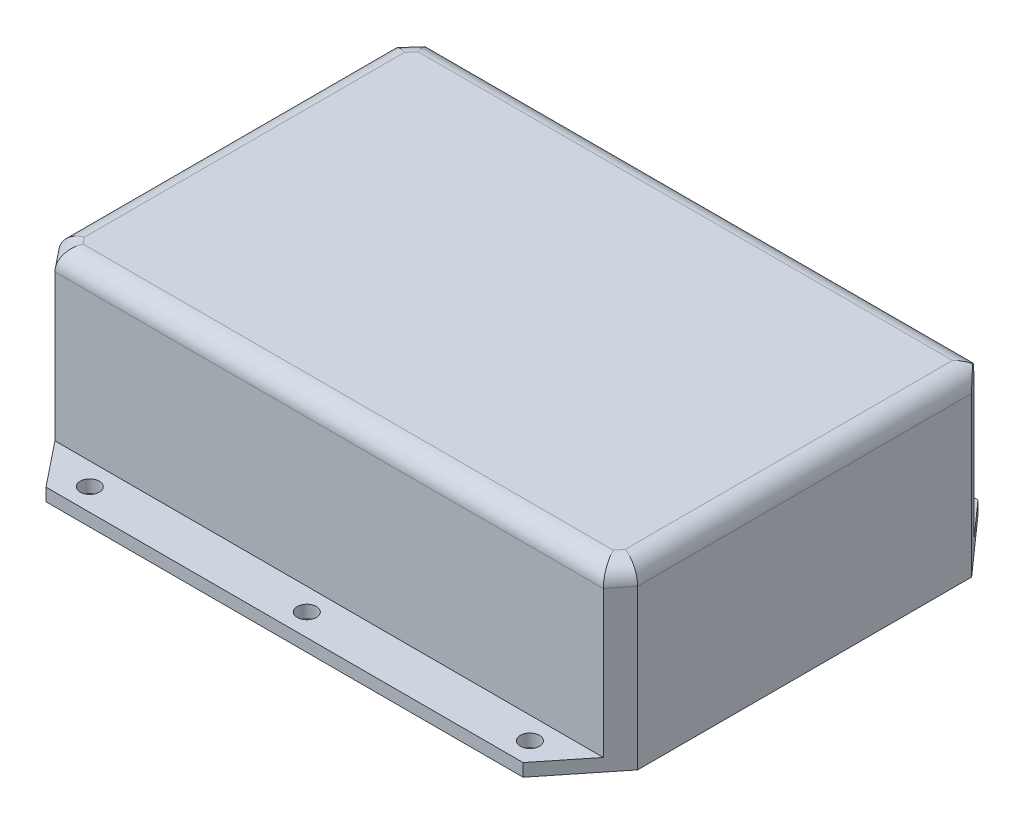
ISO-10303-21;
HEADER;
FILE_DESCRIPTION(('STEP AP214'),'2;1');
FILE_NAME('part.step','',(''),(''),'','','');
FILE_SCHEMA(('AUTOMOTIVE_DESIGN { 1 0 10303 214 1 1 1 1 }'));
ENDSEC;
DATA;
#1=APPLICATION_CONTEXT('core data for automotive mechanical design processes');
#2=APPLICATION_PROTOCOL_DEFINITION('international standard','automotive_design',2000,#1);
#3=PRODUCT_CONTEXT('',#1,'mechanical');
#4=PRODUCT('Part','Part','',(#3));
#5=PRODUCT_RELATED_PRODUCT_CATEGORY('part','',(#4));
#6=PRODUCT_DEFINITION_FORMATION('','',#4);
#7=PRODUCT_DEFINITION_CONTEXT('part definition',#1,'design');
#8=PRODUCT_DEFINITION('design','',#6,#7);
#9=PRODUCT_DEFINITION_SHAPE('','',#8);
#10=(LENGTH_UNIT() NAMED_UNIT(*) SI_UNIT(.MILLI.,.METRE.));
#11=(NAMED_UNIT(*) PLANE_ANGLE_UNIT() SI_UNIT($,.RADIAN.));
#12=(NAMED_UNIT(*) SI_UNIT($,.STERADIAN.) SOLID_ANGLE_UNIT());
#13=UNCERTAINTY_MEASURE_WITH_UNIT(LENGTH_MEASURE(1.E-05),#10,'distance_accuracy_value','');
#14=(GEOMETRIC_REPRESENTATION_CONTEXT(3) GLOBAL_UNCERTAINTY_ASSIGNED_CONTEXT((#13)) GLOBAL_UNIT_ASSIGNED_CONTEXT((#10,
#11,#12)) REPRESENTATION_CONTEXT('',''));
#15=CARTESIAN_POINT('',(0.,0.,0.));
#16=DIRECTION('',(0.,0.,1.));
#17=DIRECTION('',(1.,0.,0.));
#18=AXIS2_PLACEMENT_3D('',#15,#16,#17);
#19=CARTESIAN_POINT('',(0.,4.,0.));
#20=DIRECTION('',(0.,1.,0.));
#21=DIRECTION('',(0.,0.,1.));
#22=AXIS2_PLACEMENT_3D('',#19,#20,#21);
#23=PLANE('',#22);
#24=DIRECTION('',(-1.,0.,0.));
#25=VECTOR('',#24,1.);
#26=CARTESIAN_POINT('',(85.6666666666667,4.,-58.5));
#27=LINE('',#26,#25);
#28=CARTESIAN_POINT('',(85.6666666666667,4.,-58.5));
#29=VERTEX_POINT('',#28);
#30=CARTESIAN_POINT('',(-85.6666666666668,4.,-58.5));
#31=VERTEX_POINT('',#30);
#32=EDGE_CURVE('E293',#29,#31,#27,.T.);
#33=ORIENTED_EDGE('',*,*,#32,.F.);
#34=DIRECTION('',(-0.664363838829913,0.,-0.747409318683666));
#35=VECTOR('',#34,1.);
#36=CARTESIAN_POINT('',(76.9034482758628,4.,-68.3586206896546));
#37=LINE('',#36,#35);
#38=CARTESIAN_POINT('',(75.0000000000002,4.,-70.5));
#39=VERTEX_POINT('',#38);
#40=EDGE_CURVE('E352',#29,#39,#37,.T.);
#41=ORIENTED_EDGE('',*,*,#40,.T.);
#42=DIRECTION('',(1.,0.,0.));
#43=VECTOR('',#42,1.);
#44=CARTESIAN_POINT('',(0.,4.,-70.5));
#45=LINE('',#44,#43);
#46=CARTESIAN_POINT('',(-75.0000000000002,4.,-70.5));
#47=VERTEX_POINT('',#46);
#48=EDGE_CURVE('E359',#47,#39,#45,.T.);
#49=ORIENTED_EDGE('',*,*,#48,.F.);
#50=DIRECTION('',(0.664363838829918,0.,-0.747409318683662));
#51=VECTOR('',#50,1.);
#52=CARTESIAN_POINT('',(-76.9034482758624,4.,-68.3586206896551));
#53=LINE('',#52,#51);
#54=EDGE_CURVE('E354',#31,#47,#53,.T.);
#55=ORIENTED_EDGE('',*,*,#54,.F.);
#56=EDGE_LOOP('',(#33,#41,#49,#55));
#57=FACE_BOUND('',#56,.T.);
#58=CARTESIAN_POINT('',(0.,4.,-64.5));
#59=DIRECTION('',(0.,1.,0.));
#60=DIRECTION('',(0.,0.,1.));
#61=AXIS2_PLACEMENT_3D('',#58,#59,#60);
#62=CIRCLE('',#61,3.);
#63=CARTESIAN_POINT('',(0.,4.,-61.5));
#64=VERTEX_POINT('',#63);
#65=EDGE_CURVE('E363',#64,#64,#62,.T.);
#66=ORIENTED_EDGE('',*,*,#65,.F.);
#67=EDGE_LOOP('',(#66));
#68=FACE_BOUND('',#67,.T.);
#69=CARTESIAN_POINT('',(-68.2308075728966,4.,-64.5));
#70=DIRECTION('',(0.,1.,0.));
#71=DIRECTION('',(0.,0.,1.));
#72=AXIS2_PLACEMENT_3D('',#69,#70,#71);
#73=CIRCLE('',#72,3.00000000000001);
#74=CARTESIAN_POINT('',(-68.2308075728966,4.,-61.5));
#75=VERTEX_POINT('',#74);
#76=EDGE_CURVE('E547',#75,#75,#73,.T.);
#77=ORIENTED_EDGE('',*,*,#76,.F.);
#78=EDGE_LOOP('',(#77));
#79=FACE_BOUND('',#78,.T.);
#80=CARTESIAN_POINT('',(70.1409329893822,4.,-64.5));
#81=DIRECTION('',(0.,1.,0.));
#82=DIRECTION('',(0.,0.,1.));
#83=AXIS2_PLACEMENT_3D('',#80,#81,#82);
#84=CIRCLE('',#83,3.00000000000001);
#85=CARTESIAN_POINT('',(70.1409329893822,4.,-61.5));
#86=VERTEX_POINT('',#85);
#87=EDGE_CURVE('E544',#86,#86,#84,.T.);
#88=ORIENTED_EDGE('',*,*,#87,.F.);
#89=EDGE_LOOP('',(#88));
#90=FACE_BOUND('',#89,.T.);
#91=ADVANCED_FACE('F36',(#57,#68,#79,#90),#23,.T.);
#92=CARTESIAN_POINT('',(81.0975609756104,4.,64.8780487804872));
#93=DIRECTION('',(0.780868809443036,0.,0.624695047554418));
#94=DIRECTION('',(0.624695047554418,0.,-0.780868809443036));
#95=AXIS2_PLACEMENT_3D('',#92,#93,#94);
#96=PLANE('',#95);
#97=DIRECTION('',(0.,-1.,0.));
#98=VECTOR('',#97,1.);
#99=CARTESIAN_POINT('',(90.9999999999999,4.,52.5));
#100=LINE('',#99,#98);
#101=CARTESIAN_POINT('',(90.9999999999999,50.,52.5));
#102=VERTEX_POINT('',#101);
#103=CARTESIAN_POINT('',(90.9999999999999,0.,52.5));
#104=VERTEX_POINT('',#103);
#105=EDGE_CURVE('E323',#102,#104,#100,.T.);
#106=ORIENTED_EDGE('',*,*,#105,.F.);
#107=DIRECTION('',(0.624695047554418,0.,-0.780868809443036));
#108=VECTOR('',#107,1.);
#109=CARTESIAN_POINT('',(86.2,50.,58.5));
#110=LINE('',#109,#108);
#111=CARTESIAN_POINT('',(86.2,50.,58.5));
#112=VERTEX_POINT('',#111);
#113=EDGE_CURVE('E309',#102,#112,#110,.F.);
#114=ORIENTED_EDGE('',*,*,#113,.T.);
#115=DIRECTION('',(0.,-1.,0.));
#116=VECTOR('',#115,1.);
#117=CARTESIAN_POINT('',(86.2,56.,58.5));
#118=LINE('',#117,#116);
#119=CARTESIAN_POINT('',(86.2,4.,58.5));
#120=VERTEX_POINT('',#119);
#121=EDGE_CURVE('E302',#112,#120,#118,.T.);
#122=ORIENTED_EDGE('',*,*,#121,.T.);
#123=DIRECTION('',(-0.624695047554418,0.,0.780868809443036));
#124=VECTOR('',#123,1.);
#125=CARTESIAN_POINT('',(81.0975609756104,4.,64.8780487804872));
#126=LINE('',#125,#124);
#127=CARTESIAN_POINT('',(75.0000000000002,4.,72.5));
#128=VERTEX_POINT('',#127);
#129=EDGE_CURVE('E360',#120,#128,#126,.T.);
#130=ORIENTED_EDGE('',*,*,#129,.T.);
#131=DIRECTION('',(0.,-1.,0.));
#132=VECTOR('',#131,1.);
#133=CARTESIAN_POINT('',(75.0000000000002,4.,72.5));
#134=LINE('',#133,#132);
#135=CARTESIAN_POINT('',(75.0000000000002,0.,72.5));
#136=VERTEX_POINT('',#135);
#137=EDGE_CURVE('E378',#128,#136,#134,.T.);
#138=ORIENTED_EDGE('',*,*,#137,.T.);
#139=DIRECTION('',(-0.624695047554418,0.,0.780868809443036));
#140=VECTOR('',#139,1.);
#141=CARTESIAN_POINT('',(81.0975609756104,0.,64.8780487804872));
#142=LINE('',#141,#140);
#143=EDGE_CURVE('E396',#104,#136,#142,.T.);
#144=ORIENTED_EDGE('',*,*,#143,.F.);
#145=EDGE_LOOP('',(#106,#114,#122,#130,#138,#144));
#146=FACE_BOUND('',#145,.T.);
#147=ADVANCED_FACE('F449',(#146),#96,.T.);
#148=CARTESIAN_POINT('',(90.9999999999999,4.,0.));
#149=DIRECTION('',(-1.,0.,0.));
#150=DIRECTION('',(0.,0.,1.));
#151=AXIS2_PLACEMENT_3D('',#148,#149,#150);
#152=PLANE('',#151);
#153=DIRECTION('',(0.,-1.,0.));
#154=VECTOR('',#153,1.);
#155=CARTESIAN_POINT('',(90.9999999999999,4.,-52.5));
#156=LINE('',#155,#154);
#157=CARTESIAN_POINT('',(90.9999999999999,50.,-52.5));
#158=VERTEX_POINT('',#157);
#159=CARTESIAN_POINT('',(90.9999999999999,0.,-52.5));
#160=VERTEX_POINT('',#159);
#161=EDGE_CURVE('E433',#158,#160,#156,.T.);
#162=ORIENTED_EDGE('',*,*,#161,.F.);
#163=DIRECTION('',(0.,0.,-1.));
#164=VECTOR('',#163,1.);
#165=CARTESIAN_POINT('',(90.9999999999999,50.,0.));
#166=LINE('',#165,#164);
#167=EDGE_CURVE('E440',#158,#102,#166,.F.);
#168=ORIENTED_EDGE('',*,*,#167,.T.);
#169=ORIENTED_EDGE('',*,*,#105,.T.);
#170=DIRECTION('',(0.,0.,-1.));
#171=VECTOR('',#170,1.);
#172=CARTESIAN_POINT('',(90.9999999999999,0.,0.));
#173=LINE('',#172,#171);
#174=EDGE_CURVE('E399',#104,#160,#173,.T.);
#175=ORIENTED_EDGE('',*,*,#174,.T.);
#176=EDGE_LOOP('',(#162,#168,#169,#175));
#177=FACE_BOUND('',#176,.T.);
#178=ADVANCED_FACE('F438',(#177),#152,.F.);
#179=CARTESIAN_POINT('',(76.9034482758628,4.,-68.3586206896546));
#180=DIRECTION('',(-0.747409318683666,0.,0.664363838829913));
#181=DIRECTION('',(0.664363838829913,0.,0.747409318683666));
#182=AXIS2_PLACEMENT_3D('',#179,#180,#181);
#183=PLANE('',#182);
#184=DIRECTION('',(0.,-1.,0.));
#185=VECTOR('',#184,1.);
#186=CARTESIAN_POINT('',(85.6666666666667,56.,-58.5));
#187=LINE('',#186,#185);
#188=CARTESIAN_POINT('',(85.6666666666667,50.,-58.5));
#189=VERTEX_POINT('',#188);
#190=EDGE_CURVE('E306',#189,#29,#187,.T.);
#191=ORIENTED_EDGE('',*,*,#190,.F.);
#192=CARTESIAN_POINT('',(90.9999999999999,50.,-52.5));
#193=DIRECTION('',(-0.747409318683666,0.,0.664363838829913));
#194=DIRECTION('',(-0.664363838829913,0.,-0.747409318683666));
#195=AXIS2_PLACEMENT_3D('',#192,#193,#194);
#196=ELLIPSE('',#195,8.0277297191948,6.);
#197=CARTESIAN_POINT('',(88.1764705882352,55.0901900359491,-55.6764705882353));
#198=VERTEX_POINT('',#197);
#199=EDGE_CURVE('E61',#189,#198,#196,.F.);
#200=ORIENTED_EDGE('',*,*,#199,.T.);
#201=CARTESIAN_POINT('',(84.9999999999999,50.,-59.2500000000001));
#202=DIRECTION('',(-0.747409318683666,0.,0.664363838829913));
#203=DIRECTION('',(-0.664363838829913,0.,-0.747409318683666));
#204=AXIS2_PLACEMENT_3D('',#201,#202,#203);
#205=ELLIPSE('',#204,9.03119593409431,6.);
#206=EDGE_CURVE('E623',#198,#158,#205,.F.);
#207=ORIENTED_EDGE('',*,*,#206,.T.);
#208=ORIENTED_EDGE('',*,*,#161,.T.);
#209=DIRECTION('',(-0.664363838829913,0.,-0.747409318683666));
#210=VECTOR('',#209,1.);
#211=CARTESIAN_POINT('',(76.9034482758628,0.,-68.3586206896546));
#212=LINE('',#211,#210);
#213=CARTESIAN_POINT('',(75.0000000000002,0.,-70.5));
#214=VERTEX_POINT('',#213);
#215=EDGE_CURVE('E402',#160,#214,#212,.T.);
#216=ORIENTED_EDGE('',*,*,#215,.T.);
#217=DIRECTION('',(0.,-1.,0.));
#218=VECTOR('',#217,1.);
#219=CARTESIAN_POINT('',(75.0000000000002,4.,-70.5));
#220=LINE('',#219,#218);
#221=EDGE_CURVE('E357',#39,#214,#220,.T.);
#222=ORIENTED_EDGE('',*,*,#221,.F.);
#223=ORIENTED_EDGE('',*,*,#40,.F.);
#224=EDGE_LOOP('',(#191,#200,#207,#208,#216,#222,#223));
#225=FACE_BOUND('',#224,.T.);
#226=ADVANCED_FACE('F355',(#225),#183,.F.);
#227=CARTESIAN_POINT('',(0.,4.,-70.5));
#228=DIRECTION('',(0.,0.,-1.));
#229=DIRECTION('',(-1.,0.,0.));
#230=AXIS2_PLACEMENT_3D('',#227,#228,#229);
#231=PLANE('',#230);
#232=DIRECTION('',(1.,0.,0.));
#233=VECTOR('',#232,1.);
#234=CARTESIAN_POINT('',(0.,0.,-70.5));
#235=LINE('',#234,#233);
#236=CARTESIAN_POINT('',(-75.0000000000002,0.,-70.5));
#237=VERTEX_POINT('',#236);
#238=EDGE_CURVE('E404',#237,#214,#235,.T.);
#239=ORIENTED_EDGE('',*,*,#238,.F.);
#240=DIRECTION('',(0.,-1.,0.));
#241=VECTOR('',#240,1.);
#242=CARTESIAN_POINT('',(-75.0000000000002,4.,-70.5));
#243=LINE('',#242,#241);
#244=EDGE_CURVE('E430',#47,#237,#243,.T.);
#245=ORIENTED_EDGE('',*,*,#244,.F.);
#246=ORIENTED_EDGE('',*,*,#48,.T.);
#247=ORIENTED_EDGE('',*,*,#221,.T.);
#248=EDGE_LOOP('',(#239,#245,#246,#247));
#249=FACE_BOUND('',#248,.T.);
#250=ADVANCED_FACE('F662',(#249),#231,.T.);
#251=CARTESIAN_POINT('',(-76.9034482758624,4.,-68.3586206896551));
#252=DIRECTION('',(-0.747409318683662,0.,-0.664363838829918));
#253=DIRECTION('',(-0.664363838829918,0.,0.747409318683662));
#254=AXIS2_PLACEMENT_3D('',#251,#252,#253);
#255=PLANE('',#254);
#256=DIRECTION('',(0.,-1.,0.));
#257=VECTOR('',#256,1.);
#258=CARTESIAN_POINT('',(-91.0000000000001,4.,-52.5));
#259=LINE('',#258,#257);
#260=CARTESIAN_POINT('',(-91.0000000000001,50.,-52.5));
#261=VERTEX_POINT('',#260);
#262=CARTESIAN_POINT('',(-91.0000000000001,0.,-52.5));
#263=VERTEX_POINT('',#262);
#264=EDGE_CURVE('E428',#261,#263,#259,.T.);
#265=ORIENTED_EDGE('',*,*,#264,.F.);
#266=DIRECTION('',(-0.664363838829918,0.,0.747409318683662));
#267=VECTOR('',#266,1.);
#268=CARTESIAN_POINT('',(-85.6666666666668,50.,-58.5));
#269=LINE('',#268,#267);
#270=CARTESIAN_POINT('',(-85.6666666666668,50.,-58.5));
#271=VERTEX_POINT('',#270);
#272=EDGE_CURVE('E307',#261,#271,#269,.F.);
#273=ORIENTED_EDGE('',*,*,#272,.T.);
#274=DIRECTION('',(0.,-1.,0.));
#275=VECTOR('',#274,1.);
#276=CARTESIAN_POINT('',(-85.6666666666668,56.,-58.5));
#277=LINE('',#276,#275);
#278=EDGE_CURVE('E314',#271,#31,#277,.T.);
#279=ORIENTED_EDGE('',*,*,#278,.T.);
#280=ORIENTED_EDGE('',*,*,#54,.T.);
#281=ORIENTED_EDGE('',*,*,#244,.T.);
#282=DIRECTION('',(0.664363838829918,0.,-0.747409318683662));
#283=VECTOR('',#282,1.);
#284=CARTESIAN_POINT('',(-76.9034482758624,0.,-68.3586206896551));
#285=LINE('',#284,#283);
#286=EDGE_CURVE('E407',#263,#237,#285,.T.);
#287=ORIENTED_EDGE('',*,*,#286,.F.);
#288=EDGE_LOOP('',(#265,#273,#279,#280,#281,#287));
#289=FACE_BOUND('',#288,.T.);
#290=ADVANCED_FACE('F659',(#289),#255,.T.);
#291=CARTESIAN_POINT('',(-91.0000000000001,4.,0.));
#292=DIRECTION('',(1.,0.,0.));
#293=DIRECTION('',(0.,0.,-1.));
#294=AXIS2_PLACEMENT_3D('',#291,#292,#293);
#295=PLANE('',#294);
#296=CARTESIAN_POINT('',(-91.0000000000001,35.,20.));
#297=DIRECTION('',(-1.,0.,0.));
#298=DIRECTION('',(0.,0.,-1.));
#299=AXIS2_PLACEMENT_3D('',#296,#297,#298);
#300=CIRCLE('',#299,5.);
#301=CARTESIAN_POINT('',(-91.0000000000001,35.,25.));
#302=VERTEX_POINT('',#301);
#303=CARTESIAN_POINT('',(-91.0000000000001,40.,20.));
#304=VERTEX_POINT('',#303);
#305=EDGE_CURVE('E474',#302,#304,#300,.T.);
#306=ORIENTED_EDGE('',*,*,#305,.F.);
#307=DIRECTION('',(0.,1.,0.));
#308=VECTOR('',#307,1.);
#309=CARTESIAN_POINT('',(-91.0000000000001,0.,25.));
#310=LINE('',#309,#308);
#311=CARTESIAN_POINT('',(-91.0000000000001,0.,25.));
#312=VERTEX_POINT('',#311);
#313=EDGE_CURVE('E471',#312,#302,#310,.T.);
#314=ORIENTED_EDGE('',*,*,#313,.F.);
#315=DIRECTION('',(0.,0.,1.));
#316=VECTOR('',#315,1.);
#317=CARTESIAN_POINT('',(-91.0000000000001,0.,0.));
#318=LINE('',#317,#316);
#319=CARTESIAN_POINT('',(-91.0000000000001,0.,52.5));
#320=VERTEX_POINT('',#319);
#321=EDGE_CURVE('E410',#312,#320,#318,.T.);
#322=ORIENTED_EDGE('',*,*,#321,.T.);
#323=DIRECTION('',(0.,-1.,0.));
#324=VECTOR('',#323,1.);
#325=CARTESIAN_POINT('',(-91.0000000000001,4.,52.5));
#326=LINE('',#325,#324);
#327=CARTESIAN_POINT('',(-91.0000000000001,50.,52.5));
#328=VERTEX_POINT('',#327);
#329=EDGE_CURVE('E425',#328,#320,#326,.T.);
#330=ORIENTED_EDGE('',*,*,#329,.F.);
#331=DIRECTION('',(0.,0.,1.));
#332=VECTOR('',#331,1.);
#333=CARTESIAN_POINT('',(-91.0000000000001,50.,0.));
#334=LINE('',#333,#332);
#335=EDGE_CURVE('E45',#328,#261,#334,.F.);
#336=ORIENTED_EDGE('',*,*,#335,.T.);
#337=ORIENTED_EDGE('',*,*,#264,.T.);
#338=CARTESIAN_POINT('',(-91.0000000000001,0.,-25.));
#339=VERTEX_POINT('',#338);
#340=EDGE_CURVE('E411',#263,#339,#318,.T.);
#341=ORIENTED_EDGE('',*,*,#340,.T.);
#342=DIRECTION('',(0.,-1.,0.));
#343=VECTOR('',#342,1.);
#344=CARTESIAN_POINT('',(-91.0000000000001,0.,-25.));
#345=LINE('',#344,#343);
#346=CARTESIAN_POINT('',(-91.0000000000001,35.,-25.));
#347=VERTEX_POINT('',#346);
#348=EDGE_CURVE('E240',#347,#339,#345,.T.);
#349=ORIENTED_EDGE('',*,*,#348,.F.);
#350=CARTESIAN_POINT('',(-91.0000000000001,35.,-20.));
#351=DIRECTION('',(-1.,0.,0.));
#352=DIRECTION('',(0.,0.,-1.));
#353=AXIS2_PLACEMENT_3D('',#350,#351,#352);
#354=CIRCLE('',#353,5.);
#355=CARTESIAN_POINT('',(-91.0000000000001,40.,-20.));
#356=VERTEX_POINT('',#355);
#357=EDGE_CURVE('E218',#356,#347,#354,.T.);
#358=ORIENTED_EDGE('',*,*,#357,.F.);
#359=DIRECTION('',(0.,0.,-1.));
#360=VECTOR('',#359,1.);
#361=CARTESIAN_POINT('',(-91.0000000000001,40.,-20.));
#362=LINE('',#361,#360);
#363=EDGE_CURVE('E477',#304,#356,#362,.T.);
#364=ORIENTED_EDGE('',*,*,#363,.F.);
#365=EDGE_LOOP('',(#306,#314,#322,#330,#336,#337,#341,#349,#358,#364));
#366=FACE_BOUND('',#365,.T.);
#367=ADVANCED_FACE('F466',(#366),#295,.F.);
#368=CARTESIAN_POINT('',(-81.0975609756089,4.,64.8780487804887));
#369=DIRECTION('',(0.780868809443023,0.,-0.624695047554433));
#370=DIRECTION('',(-0.624695047554433,0.,-0.780868809443023));
#371=AXIS2_PLACEMENT_3D('',#368,#369,#370);
#372=PLANE('',#371);
#373=DIRECTION('',(0.,-1.,0.));
#374=VECTOR('',#373,1.);
#375=CARTESIAN_POINT('',(-86.2,56.,58.5));
#376=LINE('',#375,#374);
#377=CARTESIAN_POINT('',(-86.2,50.,58.5));
#378=VERTEX_POINT('',#377);
#379=CARTESIAN_POINT('',(-86.2,4.,58.5));
#380=VERTEX_POINT('',#379);
#381=EDGE_CURVE('E305',#378,#380,#376,.T.);
#382=ORIENTED_EDGE('',*,*,#381,.F.);
#383=DIRECTION('',(0.624695047554433,0.,0.780868809443023));
#384=VECTOR('',#383,1.);
#385=CARTESIAN_POINT('',(-81.0975609756089,50.,64.8780487804887));
#386=LINE('',#385,#384);
#387=EDGE_CURVE('E336',#378,#328,#386,.F.);
#388=ORIENTED_EDGE('',*,*,#387,.T.);
#389=ORIENTED_EDGE('',*,*,#329,.T.);
#390=DIRECTION('',(0.624695047554433,0.,0.780868809443023));
#391=VECTOR('',#390,1.);
#392=CARTESIAN_POINT('',(-81.0975609756089,0.,64.8780487804887));
#393=LINE('',#392,#391);
#394=CARTESIAN_POINT('',(-74.9999999999997,0.,72.5));
#395=VERTEX_POINT('',#394);
#396=EDGE_CURVE('E414',#320,#395,#393,.T.);
#397=ORIENTED_EDGE('',*,*,#396,.T.);
#398=DIRECTION('',(0.,-1.,0.));
#399=VECTOR('',#398,1.);
#400=CARTESIAN_POINT('',(-74.9999999999997,4.,72.5));
#401=LINE('',#400,#399);
#402=CARTESIAN_POINT('',(-74.9999999999997,4.,72.5));
#403=VERTEX_POINT('',#402);
#404=EDGE_CURVE('E422',#403,#395,#401,.T.);
#405=ORIENTED_EDGE('',*,*,#404,.F.);
#406=DIRECTION('',(0.624695047554433,0.,0.780868809443023));
#407=VECTOR('',#406,1.);
#408=CARTESIAN_POINT('',(-81.0975609756089,4.,64.8780487804887));
#409=LINE('',#408,#407);
#410=EDGE_CURVE('E294',#380,#403,#409,.T.);
#411=ORIENTED_EDGE('',*,*,#410,.F.);
#412=EDGE_LOOP('',(#382,#388,#389,#397,#405,#411));
#413=FACE_BOUND('',#412,.T.);
#414=ADVANCED_FACE('F460',(#413),#372,.F.);
#415=CARTESIAN_POINT('',(0.,4.,-64.5));
#416=DIRECTION('',(0.,-1.,0.));
#417=DIRECTION('',(0.,0.,-1.));
#418=AXIS2_PLACEMENT_3D('',#415,#416,#417);
#419=CYLINDRICAL_SURFACE('',#418,3.);
#420=ORIENTED_EDGE('',*,*,#65,.T.);
#421=EDGE_LOOP('',(#420));
#422=FACE_BOUND('',#421,.T.);
#423=CARTESIAN_POINT('',(0.,0.,-64.5));
#424=DIRECTION('',(0.,1.,0.));
#425=DIRECTION('',(0.,0.,1.));
#426=AXIS2_PLACEMENT_3D('',#423,#424,#425);
#427=CIRCLE('',#426,3.);
#428=CARTESIAN_POINT('',(0.,0.,-61.5));
#429=VERTEX_POINT('',#428);
#430=EDGE_CURVE('E393',#429,#429,#427,.T.);
#431=ORIENTED_EDGE('',*,*,#430,.F.);
#432=EDGE_LOOP('',(#431));
#433=FACE_BOUND('',#432,.T.);
#434=ADVANCED_FACE('F555',(#422,#433),#419,.F.);
#435=CARTESIAN_POINT('',(-68.2308075728966,4.,-64.5));
#436=DIRECTION('',(0.,-1.,0.));
#437=DIRECTION('',(0.,0.,-1.));
#438=AXIS2_PLACEMENT_3D('',#435,#436,#437);
#439=CYLINDRICAL_SURFACE('',#438,3.00000000000001);
#440=ORIENTED_EDGE('',*,*,#76,.T.);
#441=EDGE_LOOP('',(#440));
#442=FACE_BOUND('',#441,.T.);
#443=CARTESIAN_POINT('',(-68.2308075728966,0.,-64.5));
#444=DIRECTION('',(0.,1.,0.));
#445=DIRECTION('',(0.,0.,1.));
#446=AXIS2_PLACEMENT_3D('',#443,#444,#445);
#447=CIRCLE('',#446,3.00000000000001);
#448=CARTESIAN_POINT('',(-68.2308075728966,0.,-61.5));
#449=VERTEX_POINT('',#448);
#450=EDGE_CURVE('E390',#449,#449,#447,.T.);
#451=ORIENTED_EDGE('',*,*,#450,.F.);
#452=EDGE_LOOP('',(#451));
#453=FACE_BOUND('',#452,.T.);
#454=ADVANCED_FACE('F566',(#442,#453),#439,.F.);
#455=CARTESIAN_POINT('',(70.1409329893822,4.,-64.5));
#456=DIRECTION('',(0.,-1.,0.));
#457=DIRECTION('',(0.,0.,-1.));
#458=AXIS2_PLACEMENT_3D('',#455,#456,#457);
#459=CYLINDRICAL_SURFACE('',#458,3.00000000000001);
#460=ORIENTED_EDGE('',*,*,#87,.T.);
#461=EDGE_LOOP('',(#460));
#462=FACE_BOUND('',#461,.T.);
#463=CARTESIAN_POINT('',(70.1409329893822,0.,-64.5));
#464=DIRECTION('',(0.,1.,0.));
#465=DIRECTION('',(0.,0.,1.));
#466=AXIS2_PLACEMENT_3D('',#463,#464,#465);
#467=CIRCLE('',#466,3.00000000000001);
#468=CARTESIAN_POINT('',(70.1409329893822,0.,-61.5));
#469=VERTEX_POINT('',#468);
#470=EDGE_CURVE('E387',#469,#469,#467,.T.);
#471=ORIENTED_EDGE('',*,*,#470,.F.);
#472=EDGE_LOOP('',(#471));
#473=FACE_BOUND('',#472,.T.);
#474=ADVANCED_FACE('F562',(#462,#473),#459,.F.);
#475=CARTESIAN_POINT('',(0.,4.,65.5));
#476=DIRECTION('',(0.,-1.,0.));
#477=DIRECTION('',(0.,0.,-1.));
#478=AXIS2_PLACEMENT_3D('',#475,#476,#477);
#479=CYLINDRICAL_SURFACE('',#478,3.);
#480=CARTESIAN_POINT('',(0.,4.,65.5));
#481=DIRECTION('',(0.,1.,0.));
#482=DIRECTION('',(0.,0.,1.));
#483=AXIS2_PLACEMENT_3D('',#480,#481,#482);
#484=CIRCLE('',#483,3.);
#485=CARTESIAN_POINT('',(0.,4.,68.5));
#486=VERTEX_POINT('',#485);
#487=EDGE_CURVE('E542',#486,#486,#484,.T.);
#488=ORIENTED_EDGE('',*,*,#487,.T.);
#489=EDGE_LOOP('',(#488));
#490=FACE_BOUND('',#489,.T.);
#491=CARTESIAN_POINT('',(0.,0.,65.5));
#492=DIRECTION('',(0.,1.,0.));
#493=DIRECTION('',(0.,0.,1.));
#494=AXIS2_PLACEMENT_3D('',#491,#492,#493);
#495=CIRCLE('',#494,3.);
#496=CARTESIAN_POINT('',(0.,0.,68.5));
#497=VERTEX_POINT('',#496);
#498=EDGE_CURVE('E384',#497,#497,#495,.T.);
#499=ORIENTED_EDGE('',*,*,#498,.F.);
#500=EDGE_LOOP('',(#499));
#501=FACE_BOUND('',#500,.T.);
#502=ADVANCED_FACE('F565',(#490,#501),#479,.F.);
#503=CARTESIAN_POINT('',(70.1409329893822,4.,65.5));
#504=DIRECTION('',(0.,-1.,0.));
#505=DIRECTION('',(0.,0.,-1.));
#506=AXIS2_PLACEMENT_3D('',#503,#504,#505);
#507=CYLINDRICAL_SURFACE('',#506,3.00000000000001);
#508=CARTESIAN_POINT('',(70.1409329893822,4.,65.5));
#509=DIRECTION('',(0.,1.,0.));
#510=DIRECTION('',(0.,0.,1.));
#511=AXIS2_PLACEMENT_3D('',#508,#509,#510);
#512=CIRCLE('',#511,3.00000000000001);
#513=CARTESIAN_POINT('',(70.1409329893822,4.,68.5));
#514=VERTEX_POINT('',#513);
#515=EDGE_CURVE('E539',#514,#514,#512,.T.);
#516=ORIENTED_EDGE('',*,*,#515,.T.);
#517=EDGE_LOOP('',(#516));
#518=FACE_BOUND('',#517,.T.);
#519=CARTESIAN_POINT('',(70.1409329893822,0.,65.5));
#520=DIRECTION('',(0.,1.,0.));
#521=DIRECTION('',(0.,0.,1.));
#522=AXIS2_PLACEMENT_3D('',#519,#520,#521);
#523=CIRCLE('',#522,3.00000000000001);
#524=CARTESIAN_POINT('',(70.1409329893822,0.,68.5));
#525=VERTEX_POINT('',#524);
#526=EDGE_CURVE('E381',#525,#525,#523,.T.);
#527=ORIENTED_EDGE('',*,*,#526,.F.);
#528=EDGE_LOOP('',(#527));
#529=FACE_BOUND('',#528,.T.);
#530=ADVANCED_FACE('F587',(#518,#529),#507,.F.);
#531=CARTESIAN_POINT('',(-68.2308075728966,4.,65.5));
#532=DIRECTION('',(0.,-1.,0.));
#533=DIRECTION('',(0.,0.,-1.));
#534=AXIS2_PLACEMENT_3D('',#531,#532,#533);
#535=CYLINDRICAL_SURFACE('',#534,3.00000000000001);
#536=CARTESIAN_POINT('',(-68.2308075728966,4.,65.5));
#537=DIRECTION('',(0.,1.,0.));
#538=DIRECTION('',(0.,0.,1.));
#539=AXIS2_PLACEMENT_3D('',#536,#537,#538);
#540=CIRCLE('',#539,3.00000000000001);
#541=CARTESIAN_POINT('',(-68.2308075728966,4.,68.5));
#542=VERTEX_POINT('',#541);
#543=EDGE_CURVE('E420',#542,#542,#540,.T.);
#544=ORIENTED_EDGE('',*,*,#543,.T.);
#545=EDGE_LOOP('',(#544));
#546=FACE_BOUND('',#545,.T.);
#547=CARTESIAN_POINT('',(-68.2308075728966,0.,65.5));
#548=DIRECTION('',(0.,1.,0.));
#549=DIRECTION('',(0.,0.,1.));
#550=AXIS2_PLACEMENT_3D('',#547,#548,#549);
#551=CIRCLE('',#550,3.00000000000001);
#552=CARTESIAN_POINT('',(-68.2308075728966,0.,68.5));
#553=VERTEX_POINT('',#552);
#554=EDGE_CURVE('E338',#553,#553,#551,.T.);
#555=ORIENTED_EDGE('',*,*,#554,.F.);
#556=EDGE_LOOP('',(#555));
#557=FACE_BOUND('',#556,.T.);
#558=ADVANCED_FACE('F529',(#546,#557),#535,.F.);
#559=CARTESIAN_POINT('',(0.,4.,72.5));
#560=DIRECTION('',(0.,0.,-1.));
#561=DIRECTION('',(-1.,0.,0.));
#562=AXIS2_PLACEMENT_3D('',#559,#560,#561);
#563=PLANE('',#562);
#564=DIRECTION('',(1.,0.,0.));
#565=VECTOR('',#564,1.);
#566=CARTESIAN_POINT('',(0.,0.,72.5));
#567=LINE('',#566,#565);
#568=EDGE_CURVE('E417',#395,#136,#567,.T.);
#569=ORIENTED_EDGE('',*,*,#568,.T.);
#570=ORIENTED_EDGE('',*,*,#137,.F.);
#571=DIRECTION('',(1.,0.,0.));
#572=VECTOR('',#571,1.);
#573=CARTESIAN_POINT('',(0.,4.,72.5));
#574=LINE('',#573,#572);
#575=EDGE_CURVE('E375',#403,#128,#574,.T.);
#576=ORIENTED_EDGE('',*,*,#575,.F.);
#577=ORIENTED_EDGE('',*,*,#404,.T.);
#578=EDGE_LOOP('',(#569,#570,#576,#577));
#579=FACE_BOUND('',#578,.T.);
#580=ADVANCED_FACE('F454',(#579),#563,.F.);
#581=DIRECTION('',(1.,0.,0.));
#582=VECTOR('',#581,1.);
#583=CARTESIAN_POINT('',(-86.2,4.,58.5));
#584=LINE('',#583,#582);
#585=EDGE_CURVE('E277',#380,#120,#584,.T.);
#586=ORIENTED_EDGE('',*,*,#585,.F.);
#587=ORIENTED_EDGE('',*,*,#410,.T.);
#588=ORIENTED_EDGE('',*,*,#575,.T.);
#589=ORIENTED_EDGE('',*,*,#129,.F.);
#590=EDGE_LOOP('',(#586,#587,#588,#589));
#591=FACE_BOUND('',#590,.T.);
#592=ORIENTED_EDGE('',*,*,#543,.F.);
#593=EDGE_LOOP('',(#592));
#594=FACE_BOUND('',#593,.T.);
#595=ORIENTED_EDGE('',*,*,#515,.F.);
#596=EDGE_LOOP('',(#595));
#597=FACE_BOUND('',#596,.T.);
#598=ORIENTED_EDGE('',*,*,#487,.F.);
#599=EDGE_LOOP('',(#598));
#600=FACE_BOUND('',#599,.T.);
#601=ADVANCED_FACE('F515',(#591,#594,#597,#600),#23,.T.);
#602=CARTESIAN_POINT('',(0.,0.,0.));
#603=DIRECTION('',(0.,1.,0.));
#604=DIRECTION('',(0.,0.,1.));
#605=AXIS2_PLACEMENT_3D('',#602,#603,#604);
#606=PLANE('',#605);
#607=ORIENTED_EDGE('',*,*,#321,.F.);
#608=DIRECTION('',(-1.,0.,0.));
#609=VECTOR('',#608,1.);
#610=CARTESIAN_POINT('',(91.0009999999999,0.,25.));
#611=LINE('',#610,#609);
#612=CARTESIAN_POINT('',(-84.9999999999999,0.,25.));
#613=VERTEX_POINT('',#612);
#614=EDGE_CURVE('E247',#613,#312,#611,.T.);
#615=ORIENTED_EDGE('',*,*,#614,.F.);
#616=DIRECTION('',(0.,0.,-1.));
#617=VECTOR('',#616,1.);
#618=CARTESIAN_POINT('',(-84.9999999999999,0.,-52.5));
#619=LINE('',#618,#617);
#620=CARTESIAN_POINT('',(-84.9999999999999,0.,52.5));
#621=VERTEX_POINT('',#620);
#622=EDGE_CURVE('E271',#621,#613,#619,.T.);
#623=ORIENTED_EDGE('',*,*,#622,.F.);
#624=DIRECTION('',(-1.,0.,0.));
#625=VECTOR('',#624,1.);
#626=CARTESIAN_POINT('',(-84.9999999999999,0.,52.5));
#627=LINE('',#626,#625);
#628=CARTESIAN_POINT('',(84.9999999999999,0.,52.5));
#629=VERTEX_POINT('',#628);
#630=EDGE_CURVE('E267',#629,#621,#627,.T.);
#631=ORIENTED_EDGE('',*,*,#630,.F.);
#632=DIRECTION('',(0.,0.,1.));
#633=VECTOR('',#632,1.);
#634=CARTESIAN_POINT('',(84.9999999999999,0.,-52.5));
#635=LINE('',#634,#633);
#636=CARTESIAN_POINT('',(84.9999999999999,0.,-52.5));
#637=VERTEX_POINT('',#636);
#638=EDGE_CURVE('E265',#637,#629,#635,.T.);
#639=ORIENTED_EDGE('',*,*,#638,.F.);
#640=DIRECTION('',(1.,0.,0.));
#641=VECTOR('',#640,1.);
#642=CARTESIAN_POINT('',(-84.9999999999999,0.,-52.5));
#643=LINE('',#642,#641);
#644=CARTESIAN_POINT('',(-84.9999999999999,0.,-52.5));
#645=VERTEX_POINT('',#644);
#646=EDGE_CURVE('E255',#645,#637,#643,.T.);
#647=ORIENTED_EDGE('',*,*,#646,.F.);
#648=CARTESIAN_POINT('',(-84.9999999999999,0.,-25.));
#649=VERTEX_POINT('',#648);
#650=EDGE_CURVE('E270',#649,#645,#619,.T.);
#651=ORIENTED_EDGE('',*,*,#650,.F.);
#652=DIRECTION('',(-1.,0.,0.));
#653=VECTOR('',#652,1.);
#654=CARTESIAN_POINT('',(91.0009999999999,0.,-25.));
#655=LINE('',#654,#653);
#656=EDGE_CURVE('E53',#649,#339,#655,.T.);
#657=ORIENTED_EDGE('',*,*,#656,.T.);
#658=ORIENTED_EDGE('',*,*,#340,.F.);
#659=ORIENTED_EDGE('',*,*,#286,.T.);
#660=ORIENTED_EDGE('',*,*,#238,.T.);
#661=ORIENTED_EDGE('',*,*,#215,.F.);
#662=ORIENTED_EDGE('',*,*,#174,.F.);
#663=ORIENTED_EDGE('',*,*,#143,.T.);
#664=ORIENTED_EDGE('',*,*,#568,.F.);
#665=ORIENTED_EDGE('',*,*,#396,.F.);
#666=EDGE_LOOP('',(#607,#615,#623,#631,#639,#647,#651,#657,#658,#659,#660,#661,#662,#663,#664,#665));
#667=FACE_BOUND('',#666,.T.);
#668=ORIENTED_EDGE('',*,*,#554,.T.);
#669=EDGE_LOOP('',(#668));
#670=FACE_BOUND('',#669,.T.);
#671=ORIENTED_EDGE('',*,*,#526,.T.);
#672=EDGE_LOOP('',(#671));
#673=FACE_BOUND('',#672,.T.);
#674=ORIENTED_EDGE('',*,*,#498,.T.);
#675=EDGE_LOOP('',(#674));
#676=FACE_BOUND('',#675,.T.);
#677=ORIENTED_EDGE('',*,*,#470,.T.);
#678=EDGE_LOOP('',(#677));
#679=FACE_BOUND('',#678,.T.);
#680=ORIENTED_EDGE('',*,*,#450,.T.);
#681=EDGE_LOOP('',(#680));
#682=FACE_BOUND('',#681,.T.);
#683=ORIENTED_EDGE('',*,*,#430,.T.);
#684=EDGE_LOOP('',(#683));
#685=FACE_BOUND('',#684,.T.);
#686=ADVANCED_FACE('F447',(#667,#670,#673,#676,#679,#682,#685),#606,.F.);
#687=CARTESIAN_POINT('',(-86.2,56.,58.5));
#688=DIRECTION('',(0.,0.,-1.));
#689=DIRECTION('',(-1.,0.,0.));
#690=AXIS2_PLACEMENT_3D('',#687,#688,#689);
#691=PLANE('',#690);
#692=ORIENTED_EDGE('',*,*,#121,.F.);
#693=DIRECTION('',(1.,0.,0.));
#694=VECTOR('',#693,1.);
#695=CARTESIAN_POINT('',(-86.2,50.,58.5));
#696=LINE('',#695,#694);
#697=EDGE_CURVE('E11',#112,#378,#696,.F.);
#698=ORIENTED_EDGE('',*,*,#697,.T.);
#699=ORIENTED_EDGE('',*,*,#381,.T.);
#700=ORIENTED_EDGE('',*,*,#585,.T.);
#701=EDGE_LOOP('',(#692,#698,#699,#700));
#702=FACE_BOUND('',#701,.T.);
#703=ADVANCED_FACE('F528',(#702),#691,.F.);
#704=CARTESIAN_POINT('',(85.6666666666667,56.,-58.5));
#705=DIRECTION('',(0.,0.,1.));
#706=DIRECTION('',(1.,0.,0.));
#707=AXIS2_PLACEMENT_3D('',#704,#705,#706);
#708=PLANE('',#707);
#709=ORIENTED_EDGE('',*,*,#278,.F.);
#710=DIRECTION('',(-1.,0.,0.));
#711=VECTOR('',#710,1.);
#712=CARTESIAN_POINT('',(85.6666666666667,50.,-58.5));
#713=LINE('',#712,#711);
#714=EDGE_CURVE('E311',#271,#189,#713,.F.);
#715=ORIENTED_EDGE('',*,*,#714,.T.);
#716=ORIENTED_EDGE('',*,*,#190,.T.);
#717=ORIENTED_EDGE('',*,*,#32,.T.);
#718=EDGE_LOOP('',(#709,#715,#716,#717));
#719=FACE_BOUND('',#718,.T.);
#720=ADVANCED_FACE('F346',(#719),#708,.F.);
#721=CARTESIAN_POINT('',(0.,56.,0.));
#722=DIRECTION('',(0.,-1.,0.));
#723=DIRECTION('',(0.,0.,-1.));
#724=AXIS2_PLACEMENT_3D('',#721,#722,#723);
#725=PLANE('',#724);
#726=DIRECTION('',(-1.,0.,0.));
#727=VECTOR('',#726,1.);
#728=CARTESIAN_POINT('',(0.,56.,-52.5));
#729=LINE('',#728,#727);
#730=CARTESIAN_POINT('',(84.9999999999999,56.,-52.5));
#731=VERTEX_POINT('',#730);
#732=CARTESIAN_POINT('',(-82.9722702808053,56.,-52.5));
#733=VERTEX_POINT('',#732);
#734=EDGE_CURVE('E332',#731,#733,#729,.T.);
#735=ORIENTED_EDGE('',*,*,#734,.T.);
#736=DIRECTION('',(-0.664363838829918,0.,0.747409318683662));
#737=VECTOR('',#736,1.);
#738=CARTESIAN_POINT('',(-86.5155440878981,56.,-48.5138169670205));
#739=LINE('',#738,#737);
#740=CARTESIAN_POINT('',(-85.0000000000001,56.,-50.2188040659058));
#741=VERTEX_POINT('',#740);
#742=EDGE_CURVE('E334',#733,#741,#739,.T.);
#743=ORIENTED_EDGE('',*,*,#742,.T.);
#744=DIRECTION('',(0.,0.,1.));
#745=VECTOR('',#744,1.);
#746=CARTESIAN_POINT('',(-85.0000000000001,56.,0.));
#747=LINE('',#746,#745);
#748=CARTESIAN_POINT('',(-85.0000000000001,56.,50.3953136438507));
#749=VERTEX_POINT('',#748);
#750=EDGE_CURVE('E328',#741,#749,#747,.T.);
#751=ORIENTED_EDGE('',*,*,#750,.T.);
#752=DIRECTION('',(0.624695047554433,0.,0.780868809443023));
#753=VECTOR('',#752,1.);
#754=CARTESIAN_POINT('',(-76.4123481189508,56.,61.1298784951621));
#755=LINE('',#754,#753);
#756=CARTESIAN_POINT('',(-83.3162509150806,56.,52.5));
#757=VERTEX_POINT('',#756);
#758=EDGE_CURVE('E325',#749,#757,#755,.T.);
#759=ORIENTED_EDGE('',*,*,#758,.T.);
#760=DIRECTION('',(1.,0.,0.));
#761=VECTOR('',#760,1.);
#762=CARTESIAN_POINT('',(0.,56.,52.5));
#763=LINE('',#762,#761);
#764=CARTESIAN_POINT('',(83.3162509150806,56.,52.5));
#765=VERTEX_POINT('',#764);
#766=EDGE_CURVE('E320',#757,#765,#763,.T.);
#767=ORIENTED_EDGE('',*,*,#766,.T.);
#768=DIRECTION('',(0.624695047554417,0.,-0.780868809443036));
#769=VECTOR('',#768,1.);
#770=CARTESIAN_POINT('',(86.3147871433417,56.,48.7518297146735));
#771=LINE('',#770,#769);
#772=CARTESIAN_POINT('',(85.,56.,50.3953136438508));
#773=VERTEX_POINT('',#772);
#774=EDGE_CURVE('E322',#765,#773,#771,.T.);
#775=ORIENTED_EDGE('',*,*,#774,.T.);
#776=DIRECTION('',(0.,0.,-1.));
#777=VECTOR('',#776,1.);
#778=CARTESIAN_POINT('',(85.,56.,0.));
#779=LINE('',#778,#777);
#780=EDGE_CURVE('E330',#773,#731,#779,.T.);
#781=ORIENTED_EDGE('',*,*,#780,.T.);
#782=EDGE_LOOP('',(#735,#743,#751,#759,#767,#775,#781));
#783=FACE_BOUND('',#782,.T.);
#784=ADVANCED_FACE('F647',(#783),#725,.F.);
#785=CARTESIAN_POINT('',(84.9999999999999,52.,-52.5));
#786=DIRECTION('',(1.,0.,0.));
#787=DIRECTION('',(0.,0.,-1.));
#788=AXIS2_PLACEMENT_3D('',#785,#786,#787);
#789=PLANE('',#788);
#790=ORIENTED_EDGE('',*,*,#638,.T.);
#791=DIRECTION('',(0.,-1.,0.));
#792=VECTOR('',#791,1.);
#793=CARTESIAN_POINT('',(84.9999999999999,52.,52.5));
#794=LINE('',#793,#792);
#795=CARTESIAN_POINT('',(84.9999999999999,52.,52.5));
#796=VERTEX_POINT('',#795);
#797=EDGE_CURVE('E264',#796,#629,#794,.T.);
#798=ORIENTED_EDGE('',*,*,#797,.F.);
#799=DIRECTION('',(0.,0.,1.));
#800=VECTOR('',#799,1.);
#801=CARTESIAN_POINT('',(84.9999999999999,52.,-52.5));
#802=LINE('',#801,#800);
#803=CARTESIAN_POINT('',(84.9999999999999,52.,-52.5));
#804=VERTEX_POINT('',#803);
#805=EDGE_CURVE('E251',#804,#796,#802,.T.);
#806=ORIENTED_EDGE('',*,*,#805,.F.);
#807=DIRECTION('',(0.,-1.,0.));
#808=VECTOR('',#807,1.);
#809=CARTESIAN_POINT('',(84.9999999999999,52.,-52.5));
#810=LINE('',#809,#808);
#811=EDGE_CURVE('E275',#804,#637,#810,.T.);
#812=ORIENTED_EDGE('',*,*,#811,.T.);
#813=EDGE_LOOP('',(#790,#798,#806,#812));
#814=FACE_BOUND('',#813,.T.);
#815=ADVANCED_FACE('F722',(#814),#789,.F.);
#816=CARTESIAN_POINT('',(-84.9999999999999,52.,-52.5));
#817=DIRECTION('',(0.,0.,-1.));
#818=DIRECTION('',(-1.,0.,0.));
#819=AXIS2_PLACEMENT_3D('',#816,#817,#818);
#820=PLANE('',#819);
#821=ORIENTED_EDGE('',*,*,#646,.T.);
#822=ORIENTED_EDGE('',*,*,#811,.F.);
#823=DIRECTION('',(1.,0.,0.));
#824=VECTOR('',#823,1.);
#825=CARTESIAN_POINT('',(-84.9999999999999,52.,-52.5));
#826=LINE('',#825,#824);
#827=CARTESIAN_POINT('',(-84.9999999999999,52.,-52.5));
#828=VERTEX_POINT('',#827);
#829=EDGE_CURVE('E261',#828,#804,#826,.T.);
#830=ORIENTED_EDGE('',*,*,#829,.F.);
#831=DIRECTION('',(0.,-1.,0.));
#832=VECTOR('',#831,1.);
#833=CARTESIAN_POINT('',(-84.9999999999999,52.,-52.5));
#834=LINE('',#833,#832);
#835=EDGE_CURVE('E278',#828,#645,#834,.T.);
#836=ORIENTED_EDGE('',*,*,#835,.T.);
#837=EDGE_LOOP('',(#821,#822,#830,#836));
#838=FACE_BOUND('',#837,.T.);
#839=ADVANCED_FACE('F491',(#838),#820,.F.);
#840=CARTESIAN_POINT('',(-84.9999999999999,52.,-52.5));
#841=DIRECTION('',(-1.,0.,0.));
#842=DIRECTION('',(0.,0.,1.));
#843=AXIS2_PLACEMENT_3D('',#840,#841,#842);
#844=PLANE('',#843);
#845=ORIENTED_EDGE('',*,*,#622,.T.);
#846=DIRECTION('',(0.,-1.,0.));
#847=VECTOR('',#846,1.);
#848=CARTESIAN_POINT('',(-84.9999999999999,0.,25.));
#849=LINE('',#848,#847);
#850=CARTESIAN_POINT('',(-84.9999999999999,35.,25.));
#851=VERTEX_POINT('',#850);
#852=EDGE_CURVE('E239',#851,#613,#849,.T.);
#853=ORIENTED_EDGE('',*,*,#852,.F.);
#854=CARTESIAN_POINT('',(-84.9999999999999,35.,20.));
#855=DIRECTION('',(-1.,0.,0.));
#856=DIRECTION('',(0.,0.,1.));
#857=AXIS2_PLACEMENT_3D('',#854,#855,#856);
#858=CIRCLE('',#857,5.);
#859=CARTESIAN_POINT('',(-84.9999999999999,40.,20.));
#860=VERTEX_POINT('',#859);
#861=EDGE_CURVE('E233',#860,#851,#858,.F.);
#862=ORIENTED_EDGE('',*,*,#861,.F.);
#863=DIRECTION('',(0.,0.,1.));
#864=VECTOR('',#863,1.);
#865=CARTESIAN_POINT('',(-84.9999999999999,40.,-20.));
#866=LINE('',#865,#864);
#867=CARTESIAN_POINT('',(-84.9999999999999,40.,-20.));
#868=VERTEX_POINT('',#867);
#869=EDGE_CURVE('E231',#868,#860,#866,.T.);
#870=ORIENTED_EDGE('',*,*,#869,.F.);
#871=CARTESIAN_POINT('',(-84.9999999999999,35.,-20.));
#872=DIRECTION('',(-1.,0.,0.));
#873=DIRECTION('',(0.,0.,1.));
#874=AXIS2_PLACEMENT_3D('',#871,#872,#873);
#875=CIRCLE('',#874,5.);
#876=CARTESIAN_POINT('',(-84.9999999999999,35.,-25.));
#877=VERTEX_POINT('',#876);
#878=EDGE_CURVE('E215',#877,#868,#875,.F.);
#879=ORIENTED_EDGE('',*,*,#878,.F.);
#880=DIRECTION('',(0.,1.,0.));
#881=VECTOR('',#880,1.);
#882=CARTESIAN_POINT('',(-84.9999999999999,0.,-25.));
#883=LINE('',#882,#881);
#884=EDGE_CURVE('E222',#649,#877,#883,.T.);
#885=ORIENTED_EDGE('',*,*,#884,.F.);
#886=ORIENTED_EDGE('',*,*,#650,.T.);
#887=ORIENTED_EDGE('',*,*,#835,.F.);
#888=DIRECTION('',(0.,0.,-1.));
#889=VECTOR('',#888,1.);
#890=CARTESIAN_POINT('',(-84.9999999999999,52.,-52.5));
#891=LINE('',#890,#889);
#892=CARTESIAN_POINT('',(-84.9999999999999,52.,52.5));
#893=VERTEX_POINT('',#892);
#894=EDGE_CURVE('E258',#893,#828,#891,.T.);
#895=ORIENTED_EDGE('',*,*,#894,.F.);
#896=DIRECTION('',(0.,-1.,0.));
#897=VECTOR('',#896,1.);
#898=CARTESIAN_POINT('',(-84.9999999999999,52.,52.5));
#899=LINE('',#898,#897);
#900=EDGE_CURVE('E281',#893,#621,#899,.T.);
#901=ORIENTED_EDGE('',*,*,#900,.T.);
#902=EDGE_LOOP('',(#845,#853,#862,#870,#879,#885,#886,#887,#895,#901));
#903=FACE_BOUND('',#902,.T.);
#904=ADVANCED_FACE('F228',(#903),#844,.F.);
#905=CARTESIAN_POINT('',(-84.9999999999999,52.,52.5));
#906=DIRECTION('',(0.,0.,1.));
#907=DIRECTION('',(1.,0.,0.));
#908=AXIS2_PLACEMENT_3D('',#905,#906,#907);
#909=PLANE('',#908);
#910=ORIENTED_EDGE('',*,*,#630,.T.);
#911=ORIENTED_EDGE('',*,*,#900,.F.);
#912=DIRECTION('',(-1.,0.,0.));
#913=VECTOR('',#912,1.);
#914=CARTESIAN_POINT('',(-84.9999999999999,52.,52.5));
#915=LINE('',#914,#913);
#916=EDGE_CURVE('E254',#796,#893,#915,.T.);
#917=ORIENTED_EDGE('',*,*,#916,.F.);
#918=ORIENTED_EDGE('',*,*,#797,.T.);
#919=EDGE_LOOP('',(#910,#911,#917,#918));
#920=FACE_BOUND('',#919,.T.);
#921=ADVANCED_FACE('F500',(#920),#909,.F.);
#922=CARTESIAN_POINT('',(0.,52.,0.));
#923=DIRECTION('',(0.,1.,0.));
#924=DIRECTION('',(0.,0.,1.));
#925=AXIS2_PLACEMENT_3D('',#922,#923,#924);
#926=PLANE('',#925);
#927=ORIENTED_EDGE('',*,*,#805,.T.);
#928=ORIENTED_EDGE('',*,*,#916,.T.);
#929=ORIENTED_EDGE('',*,*,#894,.T.);
#930=ORIENTED_EDGE('',*,*,#829,.T.);
#931=EDGE_LOOP('',(#927,#928,#929,#930));
#932=FACE_BOUND('',#931,.T.);
#933=ADVANCED_FACE('F494',(#932),#926,.F.);
#934=CARTESIAN_POINT('',(0.,50.,-52.5));
#935=DIRECTION('',(-1.,0.,0.));
#936=DIRECTION('',(0.,0.,1.));
#937=AXIS2_PLACEMENT_3D('',#934,#935,#936);
#938=CYLINDRICAL_SURFACE('',#937,6.);
#939=CARTESIAN_POINT('',(-82.9722702808053,50.,-52.5));
#940=DIRECTION('',(-0.912240055804918,0.,0.409656051566483));
#941=DIRECTION('',(-0.409656051566483,0.,-0.912240055804917));
#942=AXIS2_PLACEMENT_3D('',#939,#940,#941);
#943=ELLIPSE('',#942,6.57721611961655,6.);
#944=EDGE_CURVE('E625',#733,#271,#943,.T.);
#945=ORIENTED_EDGE('',*,*,#944,.F.);
#946=ORIENTED_EDGE('',*,*,#734,.F.);
#947=CARTESIAN_POINT('',(84.9999999999999,50.,-52.5));
#948=DIRECTION('',(-0.707106781186548,0.,-0.707106781186547));
#949=DIRECTION('',(-0.707106781186547,0.,0.707106781186548));
#950=AXIS2_PLACEMENT_3D('',#947,#948,#949);
#951=ELLIPSE('',#950,8.48528137423857,6.);
#952=EDGE_CURVE('E40',#198,#731,#951,.F.);
#953=ORIENTED_EDGE('',*,*,#952,.F.);
#954=ORIENTED_EDGE('',*,*,#199,.F.);
#955=ORIENTED_EDGE('',*,*,#714,.F.);
#956=EDGE_LOOP('',(#945,#946,#953,#954,#955));
#957=FACE_BOUND('',#956,.T.);
#958=ADVANCED_FACE('F38',(#957),#938,.T.);
#959=CARTESIAN_POINT('',(84.9999999999999,50.,0.));
#960=DIRECTION('',(0.,0.,-1.));
#961=DIRECTION('',(-1.,0.,0.));
#962=AXIS2_PLACEMENT_3D('',#959,#960,#961);
#963=CYLINDRICAL_SURFACE('',#962,6.);
#964=ORIENTED_EDGE('',*,*,#952,.T.);
#965=ORIENTED_EDGE('',*,*,#780,.F.);
#966=CARTESIAN_POINT('',(84.9999999999999,50.,50.3953136438507));
#967=DIRECTION('',(0.331006941435496,0.,-0.943628319160419));
#968=DIRECTION('',(-0.943628319160419,0.,-0.331006941435496));
#969=AXIS2_PLACEMENT_3D('',#966,#967,#968);
#970=ELLIPSE('',#969,6.3584357083925,6.);
#971=EDGE_CURVE('E627',#102,#773,#970,.F.);
#972=ORIENTED_EDGE('',*,*,#971,.F.);
#973=ORIENTED_EDGE('',*,*,#167,.F.);
#974=ORIENTED_EDGE('',*,*,#206,.F.);
#975=EDGE_LOOP('',(#964,#965,#972,#973,#974));
#976=FACE_BOUND('',#975,.T.);
#977=ADVANCED_FACE('F611',(#976),#963,.T.);
#978=CARTESIAN_POINT('',(-72.4189923637604,50.,-64.3724376566756));
#979=DIRECTION('',(0.664363838829918,0.,-0.747409318683662));
#980=DIRECTION('',(-0.747409318683662,0.,-0.664363838829918));
#981=AXIS2_PLACEMENT_3D('',#978,#979,#980);
#982=CYLINDRICAL_SURFACE('',#981,6.);
#983=ORIENTED_EDGE('',*,*,#944,.T.);
#984=ORIENTED_EDGE('',*,*,#272,.F.);
#985=CARTESIAN_POINT('',(-85.0000000000001,50.,-50.2188040659059));
#986=DIRECTION('',(-0.355380557512885,0.,0.934721701546418));
#987=DIRECTION('',(0.934721701546418,0.,0.355380557512885));
#988=AXIS2_PLACEMENT_3D('',#985,#986,#987);
#989=ELLIPSE('',#988,6.41902289213304,6.);
#990=EDGE_CURVE('E631',#741,#261,#989,.T.);
#991=ORIENTED_EDGE('',*,*,#990,.F.);
#992=ORIENTED_EDGE('',*,*,#742,.F.);
#993=EDGE_LOOP('',(#983,#984,#991,#992));
#994=FACE_BOUND('',#993,.T.);
#995=ADVANCED_FACE('F608',(#994),#982,.T.);
#996=CARTESIAN_POINT('',(76.4123481189522,50.,61.1298784951607));
#997=DIRECTION('',(-0.624695047554418,0.,0.780868809443036));
#998=DIRECTION('',(0.780868809443036,0.,0.624695047554418));
#999=AXIS2_PLACEMENT_3D('',#996,#997,#998);
#1000=CYLINDRICAL_SURFACE('',#999,6.);
#1001=ORIENTED_EDGE('',*,*,#971,.T.);
#1002=ORIENTED_EDGE('',*,*,#774,.F.);
#1003=CARTESIAN_POINT('',(83.3162509150806,50.,52.5));
#1004=DIRECTION('',(0.901303236306854,0.,-0.433188730489138));
#1005=DIRECTION('',(0.433188730489138,0.,0.901303236306854));
#1006=AXIS2_PLACEMENT_3D('',#1003,#1004,#1005);
#1007=ELLIPSE('',#1006,6.6570270229866,6.);
#1008=EDGE_CURVE('E636',#112,#765,#1007,.F.);
#1009=ORIENTED_EDGE('',*,*,#1008,.F.);
#1010=ORIENTED_EDGE('',*,*,#113,.F.);
#1011=EDGE_LOOP('',(#1001,#1002,#1009,#1010));
#1012=FACE_BOUND('',#1011,.T.);
#1013=ADVANCED_FACE('F604',(#1012),#1000,.T.);
#1014=CARTESIAN_POINT('',(-85.0000000000001,50.,0.));
#1015=DIRECTION('',(0.,0.,1.));
#1016=DIRECTION('',(1.,0.,0.));
#1017=AXIS2_PLACEMENT_3D('',#1014,#1015,#1016);
#1018=CYLINDRICAL_SURFACE('',#1017,6.);
#1019=ORIENTED_EDGE('',*,*,#990,.T.);
#1020=ORIENTED_EDGE('',*,*,#335,.F.);
#1021=CARTESIAN_POINT('',(-85.0000000000001,50.,50.3953136438507));
#1022=DIRECTION('',(0.331006941435506,0.,0.943628319160416));
#1023=DIRECTION('',(-0.943628319160416,0.,0.331006941435506));
#1024=AXIS2_PLACEMENT_3D('',#1021,#1022,#1023);
#1025=ELLIPSE('',#1024,6.35843570839252,6.);
#1026=EDGE_CURVE('E639',#749,#328,#1025,.T.);
#1027=ORIENTED_EDGE('',*,*,#1026,.F.);
#1028=ORIENTED_EDGE('',*,*,#750,.F.);
#1029=EDGE_LOOP('',(#1019,#1020,#1027,#1028));
#1030=FACE_BOUND('',#1029,.T.);
#1031=ADVANCED_FACE('F600',(#1030),#1018,.T.);
#1032=CARTESIAN_POINT('',(0.,50.,52.5));
#1033=DIRECTION('',(1.,0.,0.));
#1034=DIRECTION('',(0.,0.,-1.));
#1035=AXIS2_PLACEMENT_3D('',#1032,#1033,#1034);
#1036=CYLINDRICAL_SURFACE('',#1035,6.);
#1037=ORIENTED_EDGE('',*,*,#1008,.T.);
#1038=ORIENTED_EDGE('',*,*,#766,.F.);
#1039=CARTESIAN_POINT('',(-83.3162509150806,50.,52.5));
#1040=DIRECTION('',(0.901303236306858,0.,0.433188730489129));
#1041=DIRECTION('',(0.433188730489129,0.,-0.901303236306858));
#1042=AXIS2_PLACEMENT_3D('',#1039,#1040,#1041);
#1043=ELLIPSE('',#1042,6.65702702298656,6.);
#1044=EDGE_CURVE('E250',#378,#757,#1043,.F.);
#1045=ORIENTED_EDGE('',*,*,#1044,.F.);
#1046=ORIENTED_EDGE('',*,*,#697,.F.);
#1047=EDGE_LOOP('',(#1037,#1038,#1045,#1046));
#1048=FACE_BOUND('',#1047,.T.);
#1049=ADVANCED_FACE('F596',(#1048),#1036,.T.);
#1050=CARTESIAN_POINT('',(-76.4123481189508,50.,61.1298784951621));
#1051=DIRECTION('',(0.624695047554433,0.,0.780868809443023));
#1052=DIRECTION('',(0.780868809443023,0.,-0.624695047554433));
#1053=AXIS2_PLACEMENT_3D('',#1050,#1051,#1052);
#1054=CYLINDRICAL_SURFACE('',#1053,6.);
#1055=ORIENTED_EDGE('',*,*,#1026,.T.);
#1056=ORIENTED_EDGE('',*,*,#387,.F.);
#1057=ORIENTED_EDGE('',*,*,#1044,.T.);
#1058=ORIENTED_EDGE('',*,*,#758,.F.);
#1059=EDGE_LOOP('',(#1055,#1056,#1057,#1058));
#1060=FACE_BOUND('',#1059,.T.);
#1061=ADVANCED_FACE('F511',(#1060),#1054,.T.);
#1062=CARTESIAN_POINT('',(91.0009999999999,0.,25.));
#1063=DIRECTION('',(0.,0.,1.));
#1064=DIRECTION('',(1.,0.,0.));
#1065=AXIS2_PLACEMENT_3D('',#1062,#1063,#1064);
#1066=PLANE('',#1065);
#1067=ORIENTED_EDGE('',*,*,#852,.T.);
#1068=ORIENTED_EDGE('',*,*,#614,.T.);
#1069=ORIENTED_EDGE('',*,*,#313,.T.);
#1070=DIRECTION('',(-1.,0.,0.));
#1071=VECTOR('',#1070,1.);
#1072=CARTESIAN_POINT('',(91.0009999999999,35.,25.));
#1073=LINE('',#1072,#1071);
#1074=EDGE_CURVE('E245',#851,#302,#1073,.T.);
#1075=ORIENTED_EDGE('',*,*,#1074,.F.);
#1076=EDGE_LOOP('',(#1067,#1068,#1069,#1075));
#1077=FACE_BOUND('',#1076,.T.);
#1078=ADVANCED_FACE('F501',(#1077),#1066,.F.);
#1079=CARTESIAN_POINT('',(91.0009999999999,35.,20.));
#1080=DIRECTION('',(-1.,0.,0.));
#1081=DIRECTION('',(0.,0.,1.));
#1082=AXIS2_PLACEMENT_3D('',#1079,#1080,#1081);
#1083=CYLINDRICAL_SURFACE('',#1082,5.);
#1084=ORIENTED_EDGE('',*,*,#861,.T.);
#1085=ORIENTED_EDGE('',*,*,#1074,.T.);
#1086=ORIENTED_EDGE('',*,*,#305,.T.);
#1087=DIRECTION('',(-1.,0.,0.));
#1088=VECTOR('',#1087,1.);
#1089=CARTESIAN_POINT('',(91.0009999999999,40.,20.));
#1090=LINE('',#1089,#1088);
#1091=EDGE_CURVE('E243',#860,#304,#1090,.T.);
#1092=ORIENTED_EDGE('',*,*,#1091,.F.);
#1093=EDGE_LOOP('',(#1084,#1085,#1086,#1092));
#1094=FACE_BOUND('',#1093,.T.);
#1095=ADVANCED_FACE('F503',(#1094),#1083,.F.);
#1096=CARTESIAN_POINT('',(91.0009999999999,40.,-20.));
#1097=DIRECTION('',(0.,1.,0.));
#1098=DIRECTION('',(0.,0.,1.));
#1099=AXIS2_PLACEMENT_3D('',#1096,#1097,#1098);
#1100=PLANE('',#1099);
#1101=ORIENTED_EDGE('',*,*,#869,.T.);
#1102=ORIENTED_EDGE('',*,*,#1091,.T.);
#1103=ORIENTED_EDGE('',*,*,#363,.T.);
#1104=DIRECTION('',(-1.,0.,0.));
#1105=VECTOR('',#1104,1.);
#1106=CARTESIAN_POINT('',(91.0009999999999,40.,-20.));
#1107=LINE('',#1106,#1105);
#1108=EDGE_CURVE('E220',#868,#356,#1107,.T.);
#1109=ORIENTED_EDGE('',*,*,#1108,.F.);
#1110=EDGE_LOOP('',(#1101,#1102,#1103,#1109));
#1111=FACE_BOUND('',#1110,.T.);
#1112=ADVANCED_FACE('F483',(#1111),#1100,.F.);
#1113=CARTESIAN_POINT('',(91.0009999999999,35.,-20.));
#1114=DIRECTION('',(-1.,0.,0.));
#1115=DIRECTION('',(0.,0.,1.));
#1116=AXIS2_PLACEMENT_3D('',#1113,#1114,#1115);
#1117=CYLINDRICAL_SURFACE('',#1116,5.);
#1118=ORIENTED_EDGE('',*,*,#878,.T.);
#1119=ORIENTED_EDGE('',*,*,#1108,.T.);
#1120=ORIENTED_EDGE('',*,*,#357,.T.);
#1121=DIRECTION('',(-1.,0.,0.));
#1122=VECTOR('',#1121,1.);
#1123=CARTESIAN_POINT('',(91.0009999999999,35.,-25.));
#1124=LINE('',#1123,#1122);
#1125=EDGE_CURVE('E212',#877,#347,#1124,.T.);
#1126=ORIENTED_EDGE('',*,*,#1125,.F.);
#1127=EDGE_LOOP('',(#1118,#1119,#1120,#1126));
#1128=FACE_BOUND('',#1127,.T.);
#1129=ADVANCED_FACE('F213',(#1128),#1117,.F.);
#1130=CARTESIAN_POINT('',(91.0009999999999,0.,-25.));
#1131=DIRECTION('',(0.,0.,-1.));
#1132=DIRECTION('',(-1.,0.,0.));
#1133=AXIS2_PLACEMENT_3D('',#1130,#1131,#1132);
#1134=PLANE('',#1133);
#1135=ORIENTED_EDGE('',*,*,#884,.T.);
#1136=ORIENTED_EDGE('',*,*,#1125,.T.);
#1137=ORIENTED_EDGE('',*,*,#348,.T.);
#1138=ORIENTED_EDGE('',*,*,#656,.F.);
#1139=EDGE_LOOP('',(#1135,#1136,#1137,#1138));
#1140=FACE_BOUND('',#1139,.T.);
#1141=ADVANCED_FACE('F223',(#1140),#1134,.F.);
#1142=CLOSED_SHELL('',(#91,#147,#178,#226,#250,#290,#367,#414,#434,#454,#474,#502,#530,#558,
#580,#601,#686,#703,#720,#784,#815,#839,#904,#921,#933,#958,#977,#995,#1013,#1031,#1049,#1061,
#1078,#1095,#1112,#1129,#1141));
#1143=MANIFOLD_SOLID_BREP('B2',#1142);
#1144=ADVANCED_BREP_SHAPE_REPRESENTATION('',(#18,#1143),#14);
#1145=SHAPE_DEFINITION_REPRESENTATION(#9,#1144);
ENDSEC;
END-ISO-10303-21;
